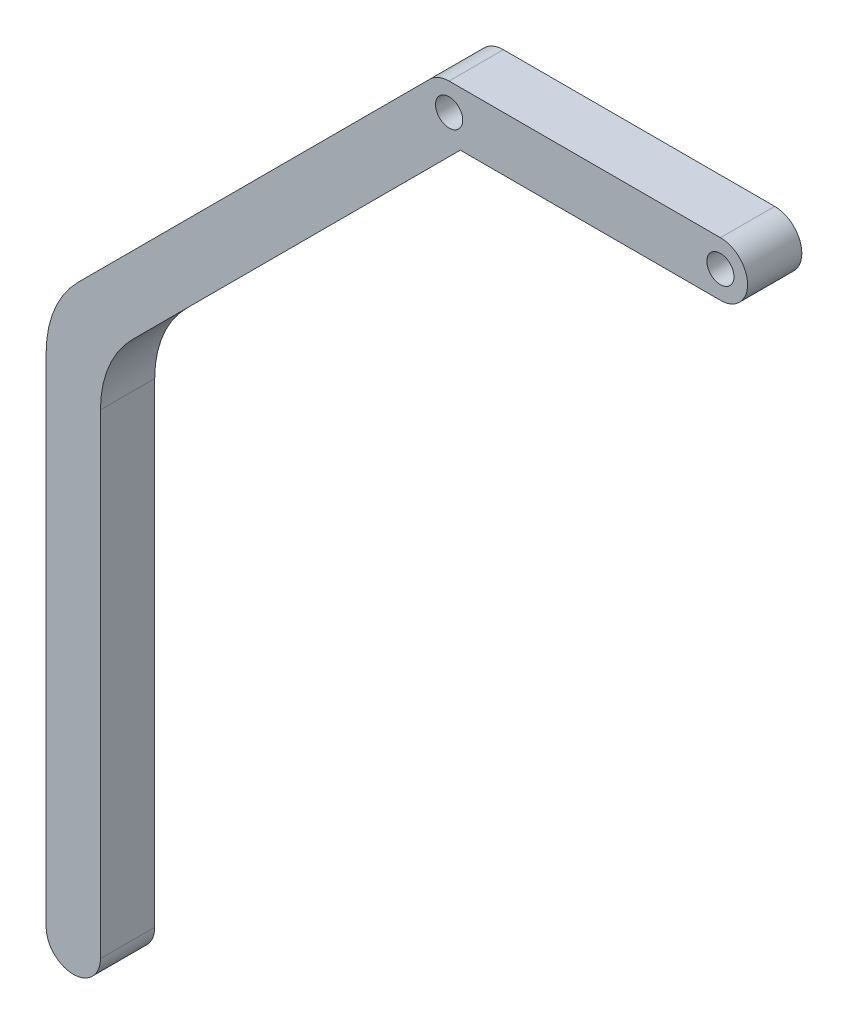
ISO-10303-21;
HEADER;
FILE_DESCRIPTION(('STEP AP214'),'2;1');
FILE_NAME('part.step','',(''),(''),'','','');
FILE_SCHEMA(('AUTOMOTIVE_DESIGN { 1 0 10303 214 1 1 1 1 }'));
ENDSEC;
DATA;
#1=APPLICATION_CONTEXT('core data for automotive mechanical design processes');
#2=APPLICATION_PROTOCOL_DEFINITION('international standard','automotive_design',2000,#1);
#3=PRODUCT_CONTEXT('',#1,'mechanical');
#4=PRODUCT('Part','Part','',(#3));
#5=PRODUCT_RELATED_PRODUCT_CATEGORY('part','',(#4));
#6=PRODUCT_DEFINITION_FORMATION('','',#4);
#7=PRODUCT_DEFINITION_CONTEXT('part definition',#1,'design');
#8=PRODUCT_DEFINITION('design','',#6,#7);
#9=PRODUCT_DEFINITION_SHAPE('','',#8);
#10=(LENGTH_UNIT() NAMED_UNIT(*) SI_UNIT(.MILLI.,.METRE.));
#11=(NAMED_UNIT(*) PLANE_ANGLE_UNIT() SI_UNIT($,.RADIAN.));
#12=(NAMED_UNIT(*) SI_UNIT($,.STERADIAN.) SOLID_ANGLE_UNIT());
#13=UNCERTAINTY_MEASURE_WITH_UNIT(LENGTH_MEASURE(1.E-05),#10,'distance_accuracy_value','');
#14=(GEOMETRIC_REPRESENTATION_CONTEXT(3) GLOBAL_UNCERTAINTY_ASSIGNED_CONTEXT((#13)) GLOBAL_UNIT_ASSIGNED_CONTEXT((#10,
#11,#12)) REPRESENTATION_CONTEXT('',''));
#15=CARTESIAN_POINT('',(0.,0.,0.));
#16=DIRECTION('',(0.,0.,1.));
#17=DIRECTION('',(1.,0.,0.));
#18=AXIS2_PLACEMENT_3D('',#15,#16,#17);
#19=CARTESIAN_POINT('',(0.,0.,10.));
#20=DIRECTION('',(0.,0.,1.));
#21=DIRECTION('',(1.,0.,0.));
#22=AXIS2_PLACEMENT_3D('',#19,#20,#21);
#23=PLANE('',#22);
#24=CARTESIAN_POINT('',(0.,0.,10.));
#25=DIRECTION('',(0.,0.,1.));
#26=DIRECTION('',(1.,0.,0.));
#27=AXIS2_PLACEMENT_3D('',#24,#25,#26);
#28=CIRCLE('',#27,2.5);
#29=CARTESIAN_POINT('',(2.5,0.,10.));
#30=VERTEX_POINT('',#29);
#31=EDGE_CURVE('E158',#30,#30,#28,.T.);
#32=ORIENTED_EDGE('',*,*,#31,.F.);
#33=EDGE_LOOP('',(#32));
#34=FACE_BOUND('',#33,.T.);
#35=CARTESIAN_POINT('',(0.,0.,10.));
#36=DIRECTION('',(0.,0.,1.));
#37=DIRECTION('',(1.,0.,0.));
#38=AXIS2_PLACEMENT_3D('',#35,#36,#37);
#39=CIRCLE('',#38,5.);
#40=CARTESIAN_POINT('',(0.,5.,10.));
#41=VERTEX_POINT('',#40);
#42=CARTESIAN_POINT('',(-3.53553390593274,3.53553390593273,10.));
#43=VERTEX_POINT('',#42);
#44=EDGE_CURVE('E175',#41,#43,#39,.T.);
#45=ORIENTED_EDGE('',*,*,#44,.T.);
#46=DIRECTION('',(-0.707106781186546,-0.707106781186549,0.));
#47=VECTOR('',#46,1.);
#48=CARTESIAN_POINT('',(-3.53553390593274,3.53553390593273,10.));
#49=LINE('',#48,#47);
#50=CARTESIAN_POINT('',(-68.3883476483183,-61.3172798364531,10.));
#51=VERTEX_POINT('',#50);
#52=EDGE_CURVE('E108',#43,#51,#49,.T.);
#53=ORIENTED_EDGE('',*,*,#52,.T.);
#54=CARTESIAN_POINT('',(-54.2462120245874,-75.4594154601841,10.));
#55=DIRECTION('',(0.,0.,1.));
#56=DIRECTION('',(1.,0.,0.));
#57=AXIS2_PLACEMENT_3D('',#54,#55,#56);
#58=CIRCLE('',#57,20.);
#59=CARTESIAN_POINT('',(-74.2462120245874,-75.459415460184,10.));
#60=VERTEX_POINT('',#59);
#61=EDGE_CURVE('E199',#51,#60,#58,.T.);
#62=ORIENTED_EDGE('',*,*,#61,.T.);
#63=DIRECTION('',(0.,-1.,0.));
#64=VECTOR('',#63,1.);
#65=CARTESIAN_POINT('',(-74.2462120245874,-75.459415460184,10.));
#66=LINE('',#65,#64);
#67=CARTESIAN_POINT('',(-74.2462120245873,-167.175144212722,10.));
#68=VERTEX_POINT('',#67);
#69=EDGE_CURVE('E218',#60,#68,#66,.T.);
#70=ORIENTED_EDGE('',*,*,#69,.T.);
#71=CARTESIAN_POINT('',(-69.2462120245873,-167.175144212722,10.));
#72=DIRECTION('',(0.,0.,1.));
#73=DIRECTION('',(1.,0.,0.));
#74=AXIS2_PLACEMENT_3D('',#71,#72,#73);
#75=CIRCLE('',#74,4.99999999999999);
#76=CARTESIAN_POINT('',(-64.2462120245873,-167.175144212722,10.));
#77=VERTEX_POINT('',#76);
#78=EDGE_CURVE('E215',#68,#77,#75,.T.);
#79=ORIENTED_EDGE('',*,*,#78,.T.);
#80=DIRECTION('',(0.,1.,0.));
#81=VECTOR('',#80,1.);
#82=CARTESIAN_POINT('',(-64.2462120245873,-167.175144212722,10.));
#83=LINE('',#82,#81);
#84=CARTESIAN_POINT('',(-64.2462120245873,-79.601551083915,10.));
#85=VERTEX_POINT('',#84);
#86=EDGE_CURVE('E217',#77,#85,#83,.T.);
#87=ORIENTED_EDGE('',*,*,#86,.T.);
#88=CARTESIAN_POINT('',(-44.2462120245874,-79.601551083915,10.));
#89=DIRECTION('',(0.,0.,-1.));
#90=DIRECTION('',(-1.,0.,0.));
#91=AXIS2_PLACEMENT_3D('',#88,#89,#90);
#92=CIRCLE('',#91,20.);
#93=CARTESIAN_POINT('',(-58.3883476483183,-65.4594154601841,10.));
#94=VERTEX_POINT('',#93);
#95=EDGE_CURVE('E220',#85,#94,#92,.T.);
#96=ORIENTED_EDGE('',*,*,#95,.T.);
#97=DIRECTION('',(0.707106781186546,0.707106781186549,0.));
#98=VECTOR('',#97,1.);
#99=CARTESIAN_POINT('',(-58.3883476483183,-65.459415460184,10.));
#100=LINE('',#99,#98);
#101=CARTESIAN_POINT('',(2.07106781186549,-4.99999999999999,10.));
#102=VERTEX_POINT('',#101);
#103=EDGE_CURVE('E136',#94,#102,#100,.T.);
#104=ORIENTED_EDGE('',*,*,#103,.T.);
#105=DIRECTION('',(1.,0.,0.));
#106=VECTOR('',#105,1.);
#107=CARTESIAN_POINT('',(2.07106781186549,-4.99999999999999,10.));
#108=LINE('',#107,#106);
#109=CARTESIAN_POINT('',(50.,-5.,10.));
#110=VERTEX_POINT('',#109);
#111=EDGE_CURVE('E130',#102,#110,#108,.T.);
#112=ORIENTED_EDGE('',*,*,#111,.T.);
#113=CARTESIAN_POINT('',(50.,0.,10.));
#114=DIRECTION('',(0.,0.,1.));
#115=DIRECTION('',(1.,0.,0.));
#116=AXIS2_PLACEMENT_3D('',#113,#114,#115);
#117=CIRCLE('',#116,5.);
#118=CARTESIAN_POINT('',(50.,5.,10.));
#119=VERTEX_POINT('',#118);
#120=EDGE_CURVE('E134',#110,#119,#117,.T.);
#121=ORIENTED_EDGE('',*,*,#120,.T.);
#122=DIRECTION('',(-1.,0.,0.));
#123=VECTOR('',#122,1.);
#124=CARTESIAN_POINT('',(0.,5.,10.));
#125=LINE('',#124,#123);
#126=EDGE_CURVE('E56',#119,#41,#125,.T.);
#127=ORIENTED_EDGE('',*,*,#126,.T.);
#128=EDGE_LOOP('',(#45,#53,#62,#70,#79,#87,#96,#104,#112,#121,#127));
#129=FACE_BOUND('',#128,.T.);
#130=CARTESIAN_POINT('',(50.,0.,10.));
#131=DIRECTION('',(0.,0.,1.));
#132=DIRECTION('',(1.,0.,0.));
#133=AXIS2_PLACEMENT_3D('',#130,#131,#132);
#134=CIRCLE('',#133,2.49999999999999);
#135=CARTESIAN_POINT('',(52.5,0.,10.));
#136=VERTEX_POINT('',#135);
#137=EDGE_CURVE('E265',#136,#136,#134,.T.);
#138=ORIENTED_EDGE('',*,*,#137,.F.);
#139=EDGE_LOOP('',(#138));
#140=FACE_BOUND('',#139,.T.);
#141=ADVANCED_FACE('F39',(#34,#129,#140),#23,.T.);
#142=CARTESIAN_POINT('',(0.,0.,0.));
#143=DIRECTION('',(0.,0.,1.));
#144=DIRECTION('',(1.,0.,0.));
#145=AXIS2_PLACEMENT_3D('',#142,#143,#144);
#146=PLANE('',#145);
#147=CARTESIAN_POINT('',(0.,0.,0.));
#148=DIRECTION('',(0.,0.,1.));
#149=DIRECTION('',(1.,0.,0.));
#150=AXIS2_PLACEMENT_3D('',#147,#148,#149);
#151=CIRCLE('',#150,5.);
#152=CARTESIAN_POINT('',(0.,5.,0.));
#153=VERTEX_POINT('',#152);
#154=CARTESIAN_POINT('',(-3.53553390593274,3.53553390593273,0.));
#155=VERTEX_POINT('',#154);
#156=EDGE_CURVE('E154',#153,#155,#151,.T.);
#157=ORIENTED_EDGE('',*,*,#156,.F.);
#158=DIRECTION('',(-1.,0.,0.));
#159=VECTOR('',#158,1.);
#160=CARTESIAN_POINT('',(0.,5.,0.));
#161=LINE('',#160,#159);
#162=CARTESIAN_POINT('',(50.,5.,0.));
#163=VERTEX_POINT('',#162);
#164=EDGE_CURVE('E100',#163,#153,#161,.T.);
#165=ORIENTED_EDGE('',*,*,#164,.F.);
#166=CARTESIAN_POINT('',(50.,0.,0.));
#167=DIRECTION('',(0.,0.,1.));
#168=DIRECTION('',(1.,0.,0.));
#169=AXIS2_PLACEMENT_3D('',#166,#167,#168);
#170=CIRCLE('',#169,5.);
#171=CARTESIAN_POINT('',(50.,-5.,0.));
#172=VERTEX_POINT('',#171);
#173=EDGE_CURVE('E94',#172,#163,#170,.T.);
#174=ORIENTED_EDGE('',*,*,#173,.F.);
#175=DIRECTION('',(1.,0.,0.));
#176=VECTOR('',#175,1.);
#177=CARTESIAN_POINT('',(2.07106781186549,-4.99999999999999,0.));
#178=LINE('',#177,#176);
#179=CARTESIAN_POINT('',(2.07106781186549,-4.99999999999999,0.));
#180=VERTEX_POINT('',#179);
#181=EDGE_CURVE('E144',#180,#172,#178,.T.);
#182=ORIENTED_EDGE('',*,*,#181,.F.);
#183=DIRECTION('',(0.707106781186546,0.707106781186549,0.));
#184=VECTOR('',#183,1.);
#185=CARTESIAN_POINT('',(-58.3883476483183,-65.459415460184,0.));
#186=LINE('',#185,#184);
#187=CARTESIAN_POINT('',(-58.3883476483183,-65.4594154601841,0.));
#188=VERTEX_POINT('',#187);
#189=EDGE_CURVE('E170',#188,#180,#186,.T.);
#190=ORIENTED_EDGE('',*,*,#189,.F.);
#191=CARTESIAN_POINT('',(-44.2462120245874,-79.601551083915,0.));
#192=DIRECTION('',(0.,0.,-1.));
#193=DIRECTION('',(-1.,0.,0.));
#194=AXIS2_PLACEMENT_3D('',#191,#192,#193);
#195=CIRCLE('',#194,20.);
#196=CARTESIAN_POINT('',(-64.2462120245873,-79.601551083915,0.));
#197=VERTEX_POINT('',#196);
#198=EDGE_CURVE('E168',#197,#188,#195,.T.);
#199=ORIENTED_EDGE('',*,*,#198,.F.);
#200=DIRECTION('',(0.,1.,0.));
#201=VECTOR('',#200,1.);
#202=CARTESIAN_POINT('',(-64.2462120245873,-167.175144212722,0.));
#203=LINE('',#202,#201);
#204=CARTESIAN_POINT('',(-64.2462120245873,-167.175144212722,0.));
#205=VERTEX_POINT('',#204);
#206=EDGE_CURVE('E166',#205,#197,#203,.T.);
#207=ORIENTED_EDGE('',*,*,#206,.F.);
#208=CARTESIAN_POINT('',(-69.2462120245873,-167.175144212722,0.));
#209=DIRECTION('',(0.,0.,1.));
#210=DIRECTION('',(1.,0.,0.));
#211=AXIS2_PLACEMENT_3D('',#208,#209,#210);
#212=CIRCLE('',#211,4.99999999999999);
#213=CARTESIAN_POINT('',(-74.2462120245873,-167.175144212722,0.));
#214=VERTEX_POINT('',#213);
#215=EDGE_CURVE('E164',#214,#205,#212,.T.);
#216=ORIENTED_EDGE('',*,*,#215,.F.);
#217=DIRECTION('',(0.,-1.,0.));
#218=VECTOR('',#217,1.);
#219=CARTESIAN_POINT('',(-74.2462120245874,-75.459415460184,0.));
#220=LINE('',#219,#218);
#221=CARTESIAN_POINT('',(-74.2462120245874,-75.459415460184,0.));
#222=VERTEX_POINT('',#221);
#223=EDGE_CURVE('E162',#222,#214,#220,.T.);
#224=ORIENTED_EDGE('',*,*,#223,.F.);
#225=CARTESIAN_POINT('',(-54.2462120245874,-75.4594154601841,0.));
#226=DIRECTION('',(0.,0.,1.));
#227=DIRECTION('',(1.,0.,0.));
#228=AXIS2_PLACEMENT_3D('',#225,#226,#227);
#229=CIRCLE('',#228,20.);
#230=CARTESIAN_POINT('',(-68.3883476483183,-61.3172798364531,0.));
#231=VERTEX_POINT('',#230);
#232=EDGE_CURVE('E160',#231,#222,#229,.T.);
#233=ORIENTED_EDGE('',*,*,#232,.F.);
#234=DIRECTION('',(-0.707106781186546,-0.707106781186549,0.));
#235=VECTOR('',#234,1.);
#236=CARTESIAN_POINT('',(-3.53553390593274,3.53553390593273,0.));
#237=LINE('',#236,#235);
#238=EDGE_CURVE('E157',#155,#231,#237,.T.);
#239=ORIENTED_EDGE('',*,*,#238,.F.);
#240=EDGE_LOOP('',(#157,#165,#174,#182,#190,#199,#207,#216,#224,#233,#239));
#241=FACE_BOUND('',#240,.T.);
#242=CARTESIAN_POINT('',(0.,0.,0.));
#243=DIRECTION('',(0.,0.,1.));
#244=DIRECTION('',(1.,0.,0.));
#245=AXIS2_PLACEMENT_3D('',#242,#243,#244);
#246=CIRCLE('',#245,2.5);
#247=CARTESIAN_POINT('',(2.5,0.,0.));
#248=VERTEX_POINT('',#247);
#249=EDGE_CURVE('E271',#248,#248,#246,.T.);
#250=ORIENTED_EDGE('',*,*,#249,.T.);
#251=EDGE_LOOP('',(#250));
#252=FACE_BOUND('',#251,.T.);
#253=CARTESIAN_POINT('',(50.,0.,0.));
#254=DIRECTION('',(0.,0.,1.));
#255=DIRECTION('',(1.,0.,0.));
#256=AXIS2_PLACEMENT_3D('',#253,#254,#255);
#257=CIRCLE('',#256,2.49999999999999);
#258=CARTESIAN_POINT('',(52.5,0.,0.));
#259=VERTEX_POINT('',#258);
#260=EDGE_CURVE('E268',#259,#259,#257,.T.);
#261=ORIENTED_EDGE('',*,*,#260,.T.);
#262=EDGE_LOOP('',(#261));
#263=FACE_BOUND('',#262,.T.);
#264=ADVANCED_FACE('F203',(#241,#252,#263),#146,.F.);
#265=CARTESIAN_POINT('',(0.,0.,10.));
#266=DIRECTION('',(0.,0.,-1.));
#267=DIRECTION('',(-1.,0.,0.));
#268=AXIS2_PLACEMENT_3D('',#265,#266,#267);
#269=CYLINDRICAL_SURFACE('',#268,5.);
#270=ORIENTED_EDGE('',*,*,#156,.T.);
#271=DIRECTION('',(0.,0.,-1.));
#272=VECTOR('',#271,1.);
#273=CARTESIAN_POINT('',(-3.53553390593274,3.53553390593273,10.));
#274=LINE('',#273,#272);
#275=EDGE_CURVE('E11',#43,#155,#274,.T.);
#276=ORIENTED_EDGE('',*,*,#275,.F.);
#277=ORIENTED_EDGE('',*,*,#44,.F.);
#278=DIRECTION('',(0.,0.,-1.));
#279=VECTOR('',#278,1.);
#280=CARTESIAN_POINT('',(0.,5.,10.));
#281=LINE('',#280,#279);
#282=EDGE_CURVE('E150',#41,#153,#281,.T.);
#283=ORIENTED_EDGE('',*,*,#282,.T.);
#284=EDGE_LOOP('',(#270,#276,#277,#283));
#285=FACE_BOUND('',#284,.T.);
#286=ADVANCED_FACE('F41',(#285),#269,.T.);
#287=CARTESIAN_POINT('',(-3.53553390593274,3.53553390593273,10.));
#288=DIRECTION('',(0.707106781186549,-0.707106781186546,0.));
#289=DIRECTION('',(0.707106781186546,0.707106781186549,0.));
#290=AXIS2_PLACEMENT_3D('',#287,#288,#289);
#291=PLANE('',#290);
#292=ORIENTED_EDGE('',*,*,#238,.T.);
#293=DIRECTION('',(0.,0.,-1.));
#294=VECTOR('',#293,1.);
#295=CARTESIAN_POINT('',(-68.3883476483183,-61.3172798364531,10.));
#296=LINE('',#295,#294);
#297=EDGE_CURVE('E48',#51,#231,#296,.T.);
#298=ORIENTED_EDGE('',*,*,#297,.F.);
#299=ORIENTED_EDGE('',*,*,#52,.F.);
#300=ORIENTED_EDGE('',*,*,#275,.T.);
#301=EDGE_LOOP('',(#292,#298,#299,#300));
#302=FACE_BOUND('',#301,.T.);
#303=ADVANCED_FACE('F356',(#302),#291,.F.);
#304=CARTESIAN_POINT('',(-54.2462120245874,-75.4594154601841,10.));
#305=DIRECTION('',(0.,0.,-1.));
#306=DIRECTION('',(-1.,0.,0.));
#307=AXIS2_PLACEMENT_3D('',#304,#305,#306);
#308=CYLINDRICAL_SURFACE('',#307,20.);
#309=ORIENTED_EDGE('',*,*,#232,.T.);
#310=DIRECTION('',(0.,0.,-1.));
#311=VECTOR('',#310,1.);
#312=CARTESIAN_POINT('',(-74.2462120245874,-75.459415460184,10.));
#313=LINE('',#312,#311);
#314=EDGE_CURVE('E191',#60,#222,#313,.T.);
#315=ORIENTED_EDGE('',*,*,#314,.F.);
#316=ORIENTED_EDGE('',*,*,#61,.F.);
#317=ORIENTED_EDGE('',*,*,#297,.T.);
#318=EDGE_LOOP('',(#309,#315,#316,#317));
#319=FACE_BOUND('',#318,.T.);
#320=ADVANCED_FACE('F197',(#319),#308,.T.);
#321=CARTESIAN_POINT('',(-74.2462120245874,-75.459415460184,10.));
#322=DIRECTION('',(1.,0.,0.));
#323=DIRECTION('',(0.,1.,0.));
#324=AXIS2_PLACEMENT_3D('',#321,#322,#323);
#325=PLANE('',#324);
#326=ORIENTED_EDGE('',*,*,#223,.T.);
#327=DIRECTION('',(0.,0.,-1.));
#328=VECTOR('',#327,1.);
#329=CARTESIAN_POINT('',(-74.2462120245873,-167.175144212722,10.));
#330=LINE('',#329,#328);
#331=EDGE_CURVE('E188',#68,#214,#330,.T.);
#332=ORIENTED_EDGE('',*,*,#331,.F.);
#333=ORIENTED_EDGE('',*,*,#69,.F.);
#334=ORIENTED_EDGE('',*,*,#314,.T.);
#335=EDGE_LOOP('',(#326,#332,#333,#334));
#336=FACE_BOUND('',#335,.T.);
#337=ADVANCED_FACE('F209',(#336),#325,.F.);
#338=CARTESIAN_POINT('',(-69.2462120245873,-167.175144212722,10.));
#339=DIRECTION('',(0.,0.,-1.));
#340=DIRECTION('',(-1.,0.,0.));
#341=AXIS2_PLACEMENT_3D('',#338,#339,#340);
#342=CYLINDRICAL_SURFACE('',#341,4.99999999999999);
#343=ORIENTED_EDGE('',*,*,#215,.T.);
#344=DIRECTION('',(0.,0.,-1.));
#345=VECTOR('',#344,1.);
#346=CARTESIAN_POINT('',(-64.2462120245873,-167.175144212722,10.));
#347=LINE('',#346,#345);
#348=EDGE_CURVE('E185',#77,#205,#347,.T.);
#349=ORIENTED_EDGE('',*,*,#348,.F.);
#350=ORIENTED_EDGE('',*,*,#78,.F.);
#351=ORIENTED_EDGE('',*,*,#331,.T.);
#352=EDGE_LOOP('',(#343,#349,#350,#351));
#353=FACE_BOUND('',#352,.T.);
#354=ADVANCED_FACE('F213',(#353),#342,.T.);
#355=CARTESIAN_POINT('',(-64.2462120245873,-167.175144212722,10.));
#356=DIRECTION('',(-1.,0.,0.));
#357=DIRECTION('',(0.,-1.,0.));
#358=AXIS2_PLACEMENT_3D('',#355,#356,#357);
#359=PLANE('',#358);
#360=ORIENTED_EDGE('',*,*,#206,.T.);
#361=DIRECTION('',(0.,0.,-1.));
#362=VECTOR('',#361,1.);
#363=CARTESIAN_POINT('',(-64.2462120245873,-79.601551083915,10.));
#364=LINE('',#363,#362);
#365=EDGE_CURVE('E182',#85,#197,#364,.T.);
#366=ORIENTED_EDGE('',*,*,#365,.F.);
#367=ORIENTED_EDGE('',*,*,#86,.F.);
#368=ORIENTED_EDGE('',*,*,#348,.T.);
#369=EDGE_LOOP('',(#360,#366,#367,#368));
#370=FACE_BOUND('',#369,.T.);
#371=ADVANCED_FACE('F322',(#370),#359,.F.);
#372=CARTESIAN_POINT('',(-44.2462120245874,-79.601551083915,10.));
#373=DIRECTION('',(0.,0.,-1.));
#374=DIRECTION('',(-1.,0.,0.));
#375=AXIS2_PLACEMENT_3D('',#372,#373,#374);
#376=CYLINDRICAL_SURFACE('',#375,20.);
#377=ORIENTED_EDGE('',*,*,#198,.T.);
#378=DIRECTION('',(0.,0.,-1.));
#379=VECTOR('',#378,1.);
#380=CARTESIAN_POINT('',(-58.3883476483183,-65.4594154601841,10.));
#381=LINE('',#380,#379);
#382=EDGE_CURVE('E179',#94,#188,#381,.T.);
#383=ORIENTED_EDGE('',*,*,#382,.F.);
#384=ORIENTED_EDGE('',*,*,#95,.F.);
#385=ORIENTED_EDGE('',*,*,#365,.T.);
#386=EDGE_LOOP('',(#377,#383,#384,#385));
#387=FACE_BOUND('',#386,.T.);
#388=ADVANCED_FACE('F229',(#387),#376,.F.);
#389=CARTESIAN_POINT('',(-58.3883476483183,-65.459415460184,10.));
#390=DIRECTION('',(-0.707106781186549,0.707106781186546,0.));
#391=DIRECTION('',(-0.707106781186546,-0.707106781186549,0.));
#392=AXIS2_PLACEMENT_3D('',#389,#390,#391);
#393=PLANE('',#392);
#394=ORIENTED_EDGE('',*,*,#189,.T.);
#395=DIRECTION('',(0.,0.,-1.));
#396=VECTOR('',#395,1.);
#397=CARTESIAN_POINT('',(2.07106781186549,-4.99999999999999,10.));
#398=LINE('',#397,#396);
#399=EDGE_CURVE('E145',#102,#180,#398,.T.);
#400=ORIENTED_EDGE('',*,*,#399,.F.);
#401=ORIENTED_EDGE('',*,*,#103,.F.);
#402=ORIENTED_EDGE('',*,*,#382,.T.);
#403=EDGE_LOOP('',(#394,#400,#401,#402));
#404=FACE_BOUND('',#403,.T.);
#405=ADVANCED_FACE('F233',(#404),#393,.F.);
#406=CARTESIAN_POINT('',(2.07106781186549,-4.99999999999999,10.));
#407=DIRECTION('',(0.,1.,0.));
#408=DIRECTION('',(-1.,0.,0.));
#409=AXIS2_PLACEMENT_3D('',#406,#407,#408);
#410=PLANE('',#409);
#411=ORIENTED_EDGE('',*,*,#181,.T.);
#412=DIRECTION('',(0.,0.,-1.));
#413=VECTOR('',#412,1.);
#414=CARTESIAN_POINT('',(50.,-5.,10.));
#415=LINE('',#414,#413);
#416=EDGE_CURVE('E141',#110,#172,#415,.T.);
#417=ORIENTED_EDGE('',*,*,#416,.F.);
#418=ORIENTED_EDGE('',*,*,#111,.F.);
#419=ORIENTED_EDGE('',*,*,#399,.T.);
#420=EDGE_LOOP('',(#411,#417,#418,#419));
#421=FACE_BOUND('',#420,.T.);
#422=ADVANCED_FACE('F142',(#421),#410,.F.);
#423=CARTESIAN_POINT('',(50.,0.,10.));
#424=DIRECTION('',(0.,0.,-1.));
#425=DIRECTION('',(-1.,0.,0.));
#426=AXIS2_PLACEMENT_3D('',#423,#424,#425);
#427=CYLINDRICAL_SURFACE('',#426,5.);
#428=ORIENTED_EDGE('',*,*,#173,.T.);
#429=DIRECTION('',(0.,0.,-1.));
#430=VECTOR('',#429,1.);
#431=CARTESIAN_POINT('',(50.,5.,10.));
#432=LINE('',#431,#430);
#433=EDGE_CURVE('E146',#119,#163,#432,.T.);
#434=ORIENTED_EDGE('',*,*,#433,.F.);
#435=ORIENTED_EDGE('',*,*,#120,.F.);
#436=ORIENTED_EDGE('',*,*,#416,.T.);
#437=EDGE_LOOP('',(#428,#434,#435,#436));
#438=FACE_BOUND('',#437,.T.);
#439=ADVANCED_FACE('F148',(#438),#427,.T.);
#440=CARTESIAN_POINT('',(0.,5.,10.));
#441=DIRECTION('',(0.,-1.,0.));
#442=DIRECTION('',(1.,0.,0.));
#443=AXIS2_PLACEMENT_3D('',#440,#441,#442);
#444=PLANE('',#443);
#445=ORIENTED_EDGE('',*,*,#164,.T.);
#446=ORIENTED_EDGE('',*,*,#282,.F.);
#447=ORIENTED_EDGE('',*,*,#126,.F.);
#448=ORIENTED_EDGE('',*,*,#433,.T.);
#449=EDGE_LOOP('',(#445,#446,#447,#448));
#450=FACE_BOUND('',#449,.T.);
#451=ADVANCED_FACE('F237',(#450),#444,.F.);
#452=CARTESIAN_POINT('',(0.,0.,10.));
#453=DIRECTION('',(0.,0.,-1.));
#454=DIRECTION('',(-1.,0.,0.));
#455=AXIS2_PLACEMENT_3D('',#452,#453,#454);
#456=CYLINDRICAL_SURFACE('',#455,2.5);
#457=ORIENTED_EDGE('',*,*,#31,.T.);
#458=EDGE_LOOP('',(#457));
#459=FACE_BOUND('',#458,.T.);
#460=ORIENTED_EDGE('',*,*,#249,.F.);
#461=EDGE_LOOP('',(#460));
#462=FACE_BOUND('',#461,.T.);
#463=ADVANCED_FACE('F239',(#459,#462),#456,.F.);
#464=CARTESIAN_POINT('',(50.,0.,10.));
#465=DIRECTION('',(0.,0.,-1.));
#466=DIRECTION('',(-1.,0.,0.));
#467=AXIS2_PLACEMENT_3D('',#464,#465,#466);
#468=CYLINDRICAL_SURFACE('',#467,2.49999999999999);
#469=ORIENTED_EDGE('',*,*,#137,.T.);
#470=EDGE_LOOP('',(#469));
#471=FACE_BOUND('',#470,.T.);
#472=ORIENTED_EDGE('',*,*,#260,.F.);
#473=EDGE_LOOP('',(#472));
#474=FACE_BOUND('',#473,.T.);
#475=ADVANCED_FACE('F245',(#471,#474),#468,.F.);
#476=CLOSED_SHELL('',(#141,#264,#286,#303,#320,#337,#354,#371,#388,#405,#422,#439,#451,#463,#475));
#477=MANIFOLD_SOLID_BREP('B2',#476);
#478=ADVANCED_BREP_SHAPE_REPRESENTATION('',(#18,#477),#14);
#479=SHAPE_DEFINITION_REPRESENTATION(#9,#478);
ENDSEC;
END-ISO-10303-21;
